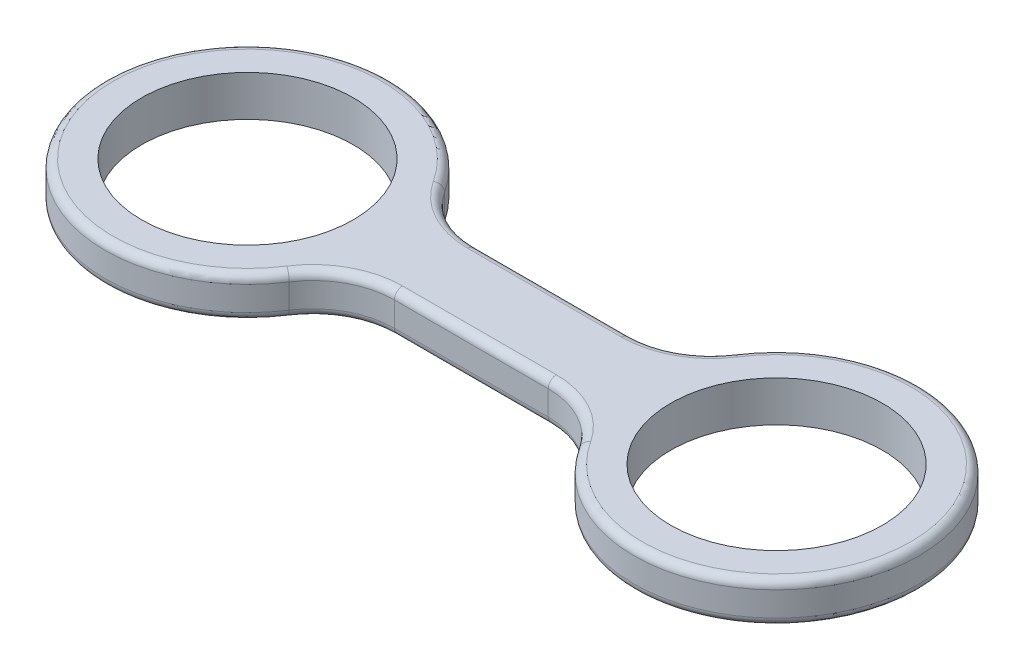
ISO-10303-21;
HEADER;
FILE_DESCRIPTION(('STEP AP214'),'2;1');
FILE_NAME('part.step','',(''),(''),'','','');
FILE_SCHEMA(('AUTOMOTIVE_DESIGN { 1 0 10303 214 1 1 1 1 }'));
ENDSEC;
DATA;
#1=APPLICATION_CONTEXT('core data for automotive mechanical design processes');
#2=APPLICATION_PROTOCOL_DEFINITION('international standard','automotive_design',2000,#1);
#3=PRODUCT_CONTEXT('',#1,'mechanical');
#4=PRODUCT('Part','Part','',(#3));
#5=PRODUCT_RELATED_PRODUCT_CATEGORY('part','',(#4));
#6=PRODUCT_DEFINITION_FORMATION('','',#4);
#7=PRODUCT_DEFINITION_CONTEXT('part definition',#1,'design');
#8=PRODUCT_DEFINITION('design','',#6,#7);
#9=PRODUCT_DEFINITION_SHAPE('','',#8);
#10=(LENGTH_UNIT() NAMED_UNIT(*) SI_UNIT(.MILLI.,.METRE.));
#11=(NAMED_UNIT(*) PLANE_ANGLE_UNIT() SI_UNIT($,.RADIAN.));
#12=(NAMED_UNIT(*) SI_UNIT($,.STERADIAN.) SOLID_ANGLE_UNIT());
#13=UNCERTAINTY_MEASURE_WITH_UNIT(LENGTH_MEASURE(1.E-05),#10,'distance_accuracy_value','');
#14=(GEOMETRIC_REPRESENTATION_CONTEXT(3) GLOBAL_UNCERTAINTY_ASSIGNED_CONTEXT((#13)) GLOBAL_UNIT_ASSIGNED_CONTEXT((#10,
#11,#12)) REPRESENTATION_CONTEXT('',''));
#15=CARTESIAN_POINT('',(0.,0.,0.));
#16=DIRECTION('',(0.,0.,1.));
#17=DIRECTION('',(1.,0.,0.));
#18=AXIS2_PLACEMENT_3D('',#15,#16,#17);
#19=CARTESIAN_POINT('',(0.,5.,0.));
#20=DIRECTION('',(0.,1.,0.));
#21=DIRECTION('',(0.,0.,1.));
#22=AXIS2_PLACEMENT_3D('',#19,#20,#21);
#23=PLANE('',#22);
#24=DIRECTION('',(-1.,0.,0.));
#25=VECTOR('',#24,1.);
#26=CARTESIAN_POINT('',(23.0488611432322,5.,-4.));
#27=LINE('',#26,#25);
#28=CARTESIAN_POINT('',(41.9511388567678,5.,-4.));
#29=VERTEX_POINT('',#28);
#30=CARTESIAN_POINT('',(23.0488611432322,5.,-4.));
#31=VERTEX_POINT('',#30);
#32=EDGE_CURVE('E61',#29,#31,#27,.T.);
#33=ORIENTED_EDGE('',*,*,#32,.T.);
#34=CARTESIAN_POINT('',(23.0488611432322,5.,-15.));
#35=DIRECTION('',(0.,1.,0.));
#36=DIRECTION('',(0.,0.,1.));
#37=AXIS2_PLACEMENT_3D('',#34,#35,#36);
#38=CIRCLE('',#37,11.);
#39=CARTESIAN_POINT('',(13.8293166859393,5.,-9.));
#40=VERTEX_POINT('',#39);
#41=EDGE_CURVE('E275',#31,#40,#38,.F.);
#42=ORIENTED_EDGE('',*,*,#41,.T.);
#43=CARTESIAN_POINT('',(0.,5.,0.));
#44=DIRECTION('',(0.,1.,0.));
#45=DIRECTION('',(0.,0.,1.));
#46=AXIS2_PLACEMENT_3D('',#43,#44,#45);
#47=CIRCLE('',#46,16.5);
#48=CARTESIAN_POINT('',(13.8293166859393,5.,9.));
#49=VERTEX_POINT('',#48);
#50=EDGE_CURVE('E256',#40,#49,#47,.T.);
#51=ORIENTED_EDGE('',*,*,#50,.T.);
#52=CARTESIAN_POINT('',(23.0488611432322,5.,15.));
#53=DIRECTION('',(0.,1.,0.));
#54=DIRECTION('',(0.,0.,1.));
#55=AXIS2_PLACEMENT_3D('',#52,#53,#54);
#56=CIRCLE('',#55,11.);
#57=CARTESIAN_POINT('',(23.0488611432322,5.,4.));
#58=VERTEX_POINT('',#57);
#59=EDGE_CURVE('E259',#49,#58,#56,.F.);
#60=ORIENTED_EDGE('',*,*,#59,.T.);
#61=DIRECTION('',(1.,0.,0.));
#62=VECTOR('',#61,1.);
#63=CARTESIAN_POINT('',(41.9511388567678,5.,4.));
#64=LINE('',#63,#62);
#65=CARTESIAN_POINT('',(41.9511388567678,5.,4.));
#66=VERTEX_POINT('',#65);
#67=EDGE_CURVE('E262',#58,#66,#64,.T.);
#68=ORIENTED_EDGE('',*,*,#67,.T.);
#69=CARTESIAN_POINT('',(41.9511388567678,5.,15.));
#70=DIRECTION('',(0.,1.,0.));
#71=DIRECTION('',(0.,0.,1.));
#72=AXIS2_PLACEMENT_3D('',#69,#70,#71);
#73=CIRCLE('',#72,11.);
#74=CARTESIAN_POINT('',(51.1706833140607,5.,9.));
#75=VERTEX_POINT('',#74);
#76=EDGE_CURVE('E265',#66,#75,#73,.F.);
#77=ORIENTED_EDGE('',*,*,#76,.T.);
#78=CARTESIAN_POINT('',(65.,5.,0.));
#79=DIRECTION('',(0.,1.,0.));
#80=DIRECTION('',(0.,0.,1.));
#81=AXIS2_PLACEMENT_3D('',#78,#79,#80);
#82=CIRCLE('',#81,16.5);
#83=CARTESIAN_POINT('',(51.1706833140607,5.,-9.));
#84=VERTEX_POINT('',#83);
#85=EDGE_CURVE('E268',#75,#84,#82,.T.);
#86=ORIENTED_EDGE('',*,*,#85,.T.);
#87=CARTESIAN_POINT('',(41.9511388567678,5.,-15.));
#88=DIRECTION('',(0.,1.,0.));
#89=DIRECTION('',(0.,0.,1.));
#90=AXIS2_PLACEMENT_3D('',#87,#88,#89);
#91=CIRCLE('',#90,11.);
#92=EDGE_CURVE('E66',#84,#29,#91,.F.);
#93=ORIENTED_EDGE('',*,*,#92,.T.);
#94=EDGE_LOOP('',(#33,#42,#51,#60,#68,#77,#86,#93));
#95=FACE_BOUND('',#94,.T.);
#96=CARTESIAN_POINT('',(0.,5.,0.));
#97=DIRECTION('',(0.,1.,0.));
#98=DIRECTION('',(0.,0.,1.));
#99=AXIS2_PLACEMENT_3D('',#96,#97,#98);
#100=CIRCLE('',#99,13.);
#101=CARTESIAN_POINT('',(0.,5.,13.));
#102=VERTEX_POINT('',#101);
#103=EDGE_CURVE('E715',#102,#102,#100,.T.);
#104=ORIENTED_EDGE('',*,*,#103,.F.);
#105=EDGE_LOOP('',(#104));
#106=FACE_BOUND('',#105,.T.);
#107=CARTESIAN_POINT('',(65.,5.,0.));
#108=DIRECTION('',(0.,1.,0.));
#109=DIRECTION('',(0.,0.,1.));
#110=AXIS2_PLACEMENT_3D('',#107,#108,#109);
#111=CIRCLE('',#110,13.);
#112=CARTESIAN_POINT('',(65.,5.,13.));
#113=VERTEX_POINT('',#112);
#114=EDGE_CURVE('E720',#113,#113,#111,.T.);
#115=ORIENTED_EDGE('',*,*,#114,.F.);
#116=EDGE_LOOP('',(#115));
#117=FACE_BOUND('',#116,.T.);
#118=ADVANCED_FACE('F43',(#95,#106,#117),#23,.T.);
#119=CARTESIAN_POINT('',(0.,0.,0.));
#120=DIRECTION('',(0.,1.,0.));
#121=DIRECTION('',(0.,0.,1.));
#122=AXIS2_PLACEMENT_3D('',#119,#120,#121);
#123=PLANE('',#122);
#124=CARTESIAN_POINT('',(0.,0.,0.));
#125=DIRECTION('',(0.,1.,0.));
#126=DIRECTION('',(0.,0.,1.));
#127=AXIS2_PLACEMENT_3D('',#124,#125,#126);
#128=CIRCLE('',#127,16.5);
#129=CARTESIAN_POINT('',(13.8293166859393,0.,9.));
#130=VERTEX_POINT('',#129);
#131=CARTESIAN_POINT('',(13.8293166859393,0.,-9.));
#132=VERTEX_POINT('',#131);
#133=EDGE_CURVE('E163',#130,#132,#128,.F.);
#134=ORIENTED_EDGE('',*,*,#133,.T.);
#135=CARTESIAN_POINT('',(23.0488611432322,0.,-15.));
#136=DIRECTION('',(0.,1.,0.));
#137=DIRECTION('',(0.,0.,1.));
#138=AXIS2_PLACEMENT_3D('',#135,#136,#137);
#139=CIRCLE('',#138,11.);
#140=CARTESIAN_POINT('',(23.0488611432322,0.,-4.));
#141=VERTEX_POINT('',#140);
#142=EDGE_CURVE('E210',#132,#141,#139,.T.);
#143=ORIENTED_EDGE('',*,*,#142,.T.);
#144=DIRECTION('',(-1.,0.,0.));
#145=VECTOR('',#144,1.);
#146=CARTESIAN_POINT('',(0.,0.,-4.));
#147=LINE('',#146,#145);
#148=CARTESIAN_POINT('',(41.9511388567678,0.,-4.));
#149=VERTEX_POINT('',#148);
#150=EDGE_CURVE('E207',#141,#149,#147,.F.);
#151=ORIENTED_EDGE('',*,*,#150,.T.);
#152=CARTESIAN_POINT('',(41.9511388567678,0.,-15.));
#153=DIRECTION('',(0.,1.,0.));
#154=DIRECTION('',(0.,0.,1.));
#155=AXIS2_PLACEMENT_3D('',#152,#153,#154);
#156=CIRCLE('',#155,11.);
#157=CARTESIAN_POINT('',(51.1706833140607,0.,-9.));
#158=VERTEX_POINT('',#157);
#159=EDGE_CURVE('E204',#149,#158,#156,.T.);
#160=ORIENTED_EDGE('',*,*,#159,.T.);
#161=CARTESIAN_POINT('',(65.,0.,0.));
#162=DIRECTION('',(0.,1.,0.));
#163=DIRECTION('',(0.,0.,1.));
#164=AXIS2_PLACEMENT_3D('',#161,#162,#163);
#165=CIRCLE('',#164,16.5);
#166=CARTESIAN_POINT('',(51.1706833140607,0.,9.));
#167=VERTEX_POINT('',#166);
#168=EDGE_CURVE('E201',#158,#167,#165,.F.);
#169=ORIENTED_EDGE('',*,*,#168,.T.);
#170=CARTESIAN_POINT('',(41.9511388567678,0.,15.));
#171=DIRECTION('',(0.,1.,0.));
#172=DIRECTION('',(0.,0.,1.));
#173=AXIS2_PLACEMENT_3D('',#170,#171,#172);
#174=CIRCLE('',#173,11.);
#175=CARTESIAN_POINT('',(41.9511388567678,0.,4.));
#176=VERTEX_POINT('',#175);
#177=EDGE_CURVE('E198',#167,#176,#174,.T.);
#178=ORIENTED_EDGE('',*,*,#177,.T.);
#179=DIRECTION('',(1.,0.,0.));
#180=VECTOR('',#179,1.);
#181=CARTESIAN_POINT('',(0.,0.,4.));
#182=LINE('',#181,#180);
#183=CARTESIAN_POINT('',(23.0488611432322,0.,4.));
#184=VERTEX_POINT('',#183);
#185=EDGE_CURVE('E166',#176,#184,#182,.F.);
#186=ORIENTED_EDGE('',*,*,#185,.T.);
#187=CARTESIAN_POINT('',(23.0488611432322,0.,15.));
#188=DIRECTION('',(0.,1.,0.));
#189=DIRECTION('',(0.,0.,1.));
#190=AXIS2_PLACEMENT_3D('',#187,#188,#189);
#191=CIRCLE('',#190,11.);
#192=EDGE_CURVE('E157',#184,#130,#191,.T.);
#193=ORIENTED_EDGE('',*,*,#192,.T.);
#194=EDGE_LOOP('',(#134,#143,#151,#160,#169,#178,#186,#193));
#195=FACE_BOUND('',#194,.T.);
#196=CARTESIAN_POINT('',(0.,0.,0.));
#197=DIRECTION('',(0.,1.,0.));
#198=DIRECTION('',(0.,0.,1.));
#199=AXIS2_PLACEMENT_3D('',#196,#197,#198);
#200=CIRCLE('',#199,13.);
#201=CARTESIAN_POINT('',(0.,0.,13.));
#202=VERTEX_POINT('',#201);
#203=EDGE_CURVE('E718',#202,#202,#200,.T.);
#204=ORIENTED_EDGE('',*,*,#203,.T.);
#205=EDGE_LOOP('',(#204));
#206=FACE_BOUND('',#205,.T.);
#207=CARTESIAN_POINT('',(65.,0.,0.));
#208=DIRECTION('',(0.,1.,0.));
#209=DIRECTION('',(0.,0.,1.));
#210=AXIS2_PLACEMENT_3D('',#207,#208,#209);
#211=CIRCLE('',#210,13.);
#212=CARTESIAN_POINT('',(65.,0.,13.));
#213=VERTEX_POINT('',#212);
#214=EDGE_CURVE('E302',#213,#213,#211,.T.);
#215=ORIENTED_EDGE('',*,*,#214,.T.);
#216=EDGE_LOOP('',(#215));
#217=FACE_BOUND('',#216,.T.);
#218=ADVANCED_FACE('F159',(#195,#206,#217),#123,.F.);
#219=CARTESIAN_POINT('',(0.,5.,0.));
#220=DIRECTION('',(0.,-1.,0.));
#221=DIRECTION('',(0.,0.,-1.));
#222=AXIS2_PLACEMENT_3D('',#219,#220,#221);
#223=CYLINDRICAL_SURFACE('',#222,17.5);
#224=DIRECTION('',(0.,-1.,0.));
#225=VECTOR('',#224,1.);
#226=CARTESIAN_POINT('',(14.6674570911478,5.,-9.54545454545454));
#227=LINE('',#226,#225);
#228=CARTESIAN_POINT('',(14.6674570911478,4.,-9.54545454545454));
#229=VERTEX_POINT('',#228);
#230=CARTESIAN_POINT('',(14.6674570911478,1.,-9.54545454545454));
#231=VERTEX_POINT('',#230);
#232=EDGE_CURVE('E359',#229,#231,#227,.T.);
#233=ORIENTED_EDGE('',*,*,#232,.T.);
#234=CARTESIAN_POINT('',(0.,1.,0.));
#235=DIRECTION('',(0.,1.,0.));
#236=DIRECTION('',(0.,0.,1.));
#237=AXIS2_PLACEMENT_3D('',#234,#235,#236);
#238=CIRCLE('',#237,17.5);
#239=CARTESIAN_POINT('',(14.6674570911478,1.,9.54545454545454));
#240=VERTEX_POINT('',#239);
#241=EDGE_CURVE('E11',#231,#240,#238,.T.);
#242=ORIENTED_EDGE('',*,*,#241,.T.);
#243=DIRECTION('',(0.,-1.,0.));
#244=VECTOR('',#243,1.);
#245=CARTESIAN_POINT('',(14.6674570911478,5.,9.54545454545454));
#246=LINE('',#245,#244);
#247=CARTESIAN_POINT('',(14.6674570911478,4.,9.54545454545454));
#248=VERTEX_POINT('',#247);
#249=EDGE_CURVE('E366',#240,#248,#246,.F.);
#250=ORIENTED_EDGE('',*,*,#249,.T.);
#251=CARTESIAN_POINT('',(0.,4.,0.));
#252=DIRECTION('',(0.,1.,0.));
#253=DIRECTION('',(0.,0.,1.));
#254=AXIS2_PLACEMENT_3D('',#251,#252,#253);
#255=CIRCLE('',#254,17.5);
#256=EDGE_CURVE('E53',#248,#229,#255,.F.);
#257=ORIENTED_EDGE('',*,*,#256,.T.);
#258=EDGE_LOOP('',(#233,#242,#250,#257));
#259=FACE_BOUND('',#258,.T.);
#260=ADVANCED_FACE('F423',(#259),#223,.T.);
#261=CARTESIAN_POINT('',(16.7705098312484,5.,5.));
#262=DIRECTION('',(0.,0.,-1.));
#263=DIRECTION('',(-1.,0.,0.));
#264=AXIS2_PLACEMENT_3D('',#261,#262,#263);
#265=PLANE('',#264);
#266=DIRECTION('',(0.,1.,0.));
#267=VECTOR('',#266,1.);
#268=CARTESIAN_POINT('',(23.0488611432322,0.,5.));
#269=LINE('',#268,#267);
#270=CARTESIAN_POINT('',(23.0488611432322,4.,5.));
#271=VERTEX_POINT('',#270);
#272=CARTESIAN_POINT('',(23.0488611432322,1.,5.));
#273=VERTEX_POINT('',#272);
#274=EDGE_CURVE('E360',#271,#273,#269,.F.);
#275=ORIENTED_EDGE('',*,*,#274,.T.);
#276=DIRECTION('',(1.,0.,0.));
#277=VECTOR('',#276,1.);
#278=CARTESIAN_POINT('',(16.7705098312484,1.,5.));
#279=LINE('',#278,#277);
#280=CARTESIAN_POINT('',(41.9511388567678,1.,5.));
#281=VERTEX_POINT('',#280);
#282=EDGE_CURVE('E248',#273,#281,#279,.T.);
#283=ORIENTED_EDGE('',*,*,#282,.T.);
#284=DIRECTION('',(0.,1.,0.));
#285=VECTOR('',#284,1.);
#286=CARTESIAN_POINT('',(41.9511388567678,5.,5.));
#287=LINE('',#286,#285);
#288=CARTESIAN_POINT('',(41.9511388567678,4.,5.));
#289=VERTEX_POINT('',#288);
#290=EDGE_CURVE('E349',#281,#289,#287,.T.);
#291=ORIENTED_EDGE('',*,*,#290,.T.);
#292=DIRECTION('',(1.,0.,0.));
#293=VECTOR('',#292,1.);
#294=CARTESIAN_POINT('',(23.0488611432322,4.,5.));
#295=LINE('',#294,#293);
#296=EDGE_CURVE('E245',#289,#271,#295,.F.);
#297=ORIENTED_EDGE('',*,*,#296,.T.);
#298=EDGE_LOOP('',(#275,#283,#291,#297));
#299=FACE_BOUND('',#298,.T.);
#300=ADVANCED_FACE('F355',(#299),#265,.F.);
#301=CARTESIAN_POINT('',(65.,5.,0.));
#302=DIRECTION('',(0.,-1.,0.));
#303=DIRECTION('',(0.,0.,-1.));
#304=AXIS2_PLACEMENT_3D('',#301,#302,#303);
#305=CYLINDRICAL_SURFACE('',#304,17.5);
#306=DIRECTION('',(0.,-1.,0.));
#307=VECTOR('',#306,1.);
#308=CARTESIAN_POINT('',(50.3325429088522,5.,9.54545454545455));
#309=LINE('',#308,#307);
#310=CARTESIAN_POINT('',(50.3325429088522,4.,9.54545454545455));
#311=VERTEX_POINT('',#310);
#312=CARTESIAN_POINT('',(50.3325429088522,1.,9.54545454545455));
#313=VERTEX_POINT('',#312);
#314=EDGE_CURVE('E352',#311,#313,#309,.T.);
#315=ORIENTED_EDGE('',*,*,#314,.T.);
#316=CARTESIAN_POINT('',(65.,1.,0.));
#317=DIRECTION('',(0.,1.,0.));
#318=DIRECTION('',(0.,0.,1.));
#319=AXIS2_PLACEMENT_3D('',#316,#317,#318);
#320=CIRCLE('',#319,17.5);
#321=CARTESIAN_POINT('',(50.3325429088522,1.,-9.54545454545455));
#322=VERTEX_POINT('',#321);
#323=EDGE_CURVE('E236',#313,#322,#320,.T.);
#324=ORIENTED_EDGE('',*,*,#323,.T.);
#325=DIRECTION('',(0.,-1.,0.));
#326=VECTOR('',#325,1.);
#327=CARTESIAN_POINT('',(50.3325429088522,5.,-9.54545454545455));
#328=LINE('',#327,#326);
#329=CARTESIAN_POINT('',(50.3325429088522,4.,-9.54545454545455));
#330=VERTEX_POINT('',#329);
#331=EDGE_CURVE('E725',#322,#330,#328,.F.);
#332=ORIENTED_EDGE('',*,*,#331,.T.);
#333=CARTESIAN_POINT('',(65.,4.,0.));
#334=DIRECTION('',(0.,1.,0.));
#335=DIRECTION('',(0.,0.,1.));
#336=AXIS2_PLACEMENT_3D('',#333,#334,#335);
#337=CIRCLE('',#336,17.5);
#338=EDGE_CURVE('E233',#330,#311,#337,.F.);
#339=ORIENTED_EDGE('',*,*,#338,.T.);
#340=EDGE_LOOP('',(#315,#324,#332,#339));
#341=FACE_BOUND('',#340,.T.);
#342=ADVANCED_FACE('F432',(#341),#305,.T.);
#343=CARTESIAN_POINT('',(16.7705098312484,5.,-5.));
#344=DIRECTION('',(0.,0.,1.));
#345=DIRECTION('',(1.,0.,0.));
#346=AXIS2_PLACEMENT_3D('',#343,#344,#345);
#347=PLANE('',#346);
#348=DIRECTION('',(0.,1.,0.));
#349=VECTOR('',#348,1.);
#350=CARTESIAN_POINT('',(41.9511388567678,0.,-5.));
#351=LINE('',#350,#349);
#352=CARTESIAN_POINT('',(41.9511388567678,4.,-5.));
#353=VERTEX_POINT('',#352);
#354=CARTESIAN_POINT('',(41.9511388567678,1.,-5.));
#355=VERTEX_POINT('',#354);
#356=EDGE_CURVE('E187',#353,#355,#351,.F.);
#357=ORIENTED_EDGE('',*,*,#356,.T.);
#358=DIRECTION('',(-1.,0.,0.));
#359=VECTOR('',#358,1.);
#360=CARTESIAN_POINT('',(16.7705098312484,1.,-5.));
#361=LINE('',#360,#359);
#362=CARTESIAN_POINT('',(23.0488611432322,1.,-5.));
#363=VERTEX_POINT('',#362);
#364=EDGE_CURVE('E224',#355,#363,#361,.T.);
#365=ORIENTED_EDGE('',*,*,#364,.T.);
#366=DIRECTION('',(0.,1.,0.));
#367=VECTOR('',#366,1.);
#368=CARTESIAN_POINT('',(23.0488611432322,5.,-5.));
#369=LINE('',#368,#367);
#370=CARTESIAN_POINT('',(23.0488611432322,4.,-5.));
#371=VERTEX_POINT('',#370);
#372=EDGE_CURVE('E192',#363,#371,#369,.T.);
#373=ORIENTED_EDGE('',*,*,#372,.T.);
#374=DIRECTION('',(-1.,0.,0.));
#375=VECTOR('',#374,1.);
#376=CARTESIAN_POINT('',(41.9511388567678,4.,-5.));
#377=LINE('',#376,#375);
#378=EDGE_CURVE('E221',#371,#353,#377,.F.);
#379=ORIENTED_EDGE('',*,*,#378,.T.);
#380=EDGE_LOOP('',(#357,#365,#373,#379));
#381=FACE_BOUND('',#380,.T.);
#382=ADVANCED_FACE('F378',(#381),#347,.F.);
#383=CARTESIAN_POINT('',(0.,5.,0.));
#384=DIRECTION('',(0.,-1.,0.));
#385=DIRECTION('',(0.,0.,-1.));
#386=AXIS2_PLACEMENT_3D('',#383,#384,#385);
#387=CYLINDRICAL_SURFACE('',#386,13.);
#388=ORIENTED_EDGE('',*,*,#103,.T.);
#389=EDGE_LOOP('',(#388));
#390=FACE_BOUND('',#389,.T.);
#391=ORIENTED_EDGE('',*,*,#203,.F.);
#392=EDGE_LOOP('',(#391));
#393=FACE_BOUND('',#392,.T.);
#394=ADVANCED_FACE('F427',(#390,#393),#387,.F.);
#395=CARTESIAN_POINT('',(65.,5.,0.));
#396=DIRECTION('',(0.,-1.,0.));
#397=DIRECTION('',(0.,0.,-1.));
#398=AXIS2_PLACEMENT_3D('',#395,#396,#397);
#399=CYLINDRICAL_SURFACE('',#398,13.);
#400=ORIENTED_EDGE('',*,*,#114,.T.);
#401=EDGE_LOOP('',(#400));
#402=FACE_BOUND('',#401,.T.);
#403=ORIENTED_EDGE('',*,*,#214,.F.);
#404=EDGE_LOOP('',(#403));
#405=FACE_BOUND('',#404,.T.);
#406=ADVANCED_FACE('F444',(#402,#405),#399,.F.);
#407=CARTESIAN_POINT('',(41.9511388567678,5.,15.));
#408=DIRECTION('',(0.,-1.,0.));
#409=DIRECTION('',(0.,0.,-1.));
#410=AXIS2_PLACEMENT_3D('',#407,#408,#409);
#411=CYLINDRICAL_SURFACE('',#410,10.);
#412=ORIENTED_EDGE('',*,*,#290,.F.);
#413=CARTESIAN_POINT('',(41.9511388567678,1.,15.));
#414=DIRECTION('',(0.,1.,0.));
#415=DIRECTION('',(0.,0.,1.));
#416=AXIS2_PLACEMENT_3D('',#413,#414,#415);
#417=CIRCLE('',#416,10.);
#418=EDGE_CURVE('E242',#281,#313,#417,.F.);
#419=ORIENTED_EDGE('',*,*,#418,.T.);
#420=ORIENTED_EDGE('',*,*,#314,.F.);
#421=CARTESIAN_POINT('',(41.9511388567678,4.,15.));
#422=DIRECTION('',(0.,1.,0.));
#423=DIRECTION('',(0.,0.,1.));
#424=AXIS2_PLACEMENT_3D('',#421,#422,#423);
#425=CIRCLE('',#424,10.);
#426=EDGE_CURVE('E239',#311,#289,#425,.T.);
#427=ORIENTED_EDGE('',*,*,#426,.T.);
#428=EDGE_LOOP('',(#412,#419,#420,#427));
#429=FACE_BOUND('',#428,.T.);
#430=ADVANCED_FACE('F348',(#429),#411,.F.);
#431=CARTESIAN_POINT('',(23.0488611432322,5.,15.));
#432=DIRECTION('',(0.,-1.,0.));
#433=DIRECTION('',(0.,0.,-1.));
#434=AXIS2_PLACEMENT_3D('',#431,#432,#433);
#435=CYLINDRICAL_SURFACE('',#434,10.);
#436=ORIENTED_EDGE('',*,*,#249,.F.);
#437=CARTESIAN_POINT('',(23.0488611432322,1.,15.));
#438=DIRECTION('',(0.,1.,0.));
#439=DIRECTION('',(0.,0.,1.));
#440=AXIS2_PLACEMENT_3D('',#437,#438,#439);
#441=CIRCLE('',#440,10.);
#442=EDGE_CURVE('E176',#240,#273,#441,.F.);
#443=ORIENTED_EDGE('',*,*,#442,.T.);
#444=ORIENTED_EDGE('',*,*,#274,.F.);
#445=CARTESIAN_POINT('',(23.0488611432322,4.,15.));
#446=DIRECTION('',(0.,1.,0.));
#447=DIRECTION('',(0.,0.,1.));
#448=AXIS2_PLACEMENT_3D('',#445,#446,#447);
#449=CIRCLE('',#448,10.);
#450=EDGE_CURVE('E251',#271,#248,#449,.T.);
#451=ORIENTED_EDGE('',*,*,#450,.T.);
#452=EDGE_LOOP('',(#436,#443,#444,#451));
#453=FACE_BOUND('',#452,.T.);
#454=ADVANCED_FACE('F443',(#453),#435,.F.);
#455=CARTESIAN_POINT('',(41.9511388567678,5.,-15.));
#456=DIRECTION('',(0.,-1.,0.));
#457=DIRECTION('',(0.,0.,-1.));
#458=AXIS2_PLACEMENT_3D('',#455,#456,#457);
#459=CYLINDRICAL_SURFACE('',#458,10.);
#460=ORIENTED_EDGE('',*,*,#331,.F.);
#461=CARTESIAN_POINT('',(41.9511388567678,1.,-15.));
#462=DIRECTION('',(0.,1.,0.));
#463=DIRECTION('',(0.,0.,1.));
#464=AXIS2_PLACEMENT_3D('',#461,#462,#463);
#465=CIRCLE('',#464,10.);
#466=EDGE_CURVE('E230',#322,#355,#465,.F.);
#467=ORIENTED_EDGE('',*,*,#466,.T.);
#468=ORIENTED_EDGE('',*,*,#356,.F.);
#469=CARTESIAN_POINT('',(41.9511388567678,4.,-15.));
#470=DIRECTION('',(0.,1.,0.));
#471=DIRECTION('',(0.,0.,1.));
#472=AXIS2_PLACEMENT_3D('',#469,#470,#471);
#473=CIRCLE('',#472,10.);
#474=EDGE_CURVE('E227',#353,#330,#473,.T.);
#475=ORIENTED_EDGE('',*,*,#474,.T.);
#476=EDGE_LOOP('',(#460,#467,#468,#475));
#477=FACE_BOUND('',#476,.T.);
#478=ADVANCED_FACE('F447',(#477),#459,.F.);
#479=CARTESIAN_POINT('',(23.0488611432322,5.,-15.));
#480=DIRECTION('',(0.,-1.,0.));
#481=DIRECTION('',(0.,0.,-1.));
#482=AXIS2_PLACEMENT_3D('',#479,#480,#481);
#483=CYLINDRICAL_SURFACE('',#482,10.);
#484=ORIENTED_EDGE('',*,*,#372,.F.);
#485=CARTESIAN_POINT('',(23.0488611432322,1.,-15.));
#486=DIRECTION('',(0.,1.,0.));
#487=DIRECTION('',(0.,0.,1.));
#488=AXIS2_PLACEMENT_3D('',#485,#486,#487);
#489=CIRCLE('',#488,10.);
#490=EDGE_CURVE('E217',#363,#231,#489,.F.);
#491=ORIENTED_EDGE('',*,*,#490,.T.);
#492=ORIENTED_EDGE('',*,*,#232,.F.);
#493=CARTESIAN_POINT('',(23.0488611432322,4.,-15.));
#494=DIRECTION('',(0.,1.,0.));
#495=DIRECTION('',(0.,0.,1.));
#496=AXIS2_PLACEMENT_3D('',#493,#494,#495);
#497=CIRCLE('',#496,10.);
#498=EDGE_CURVE('E213',#229,#371,#497,.T.);
#499=ORIENTED_EDGE('',*,*,#498,.T.);
#500=EDGE_LOOP('',(#484,#491,#492,#499));
#501=FACE_BOUND('',#500,.T.);
#502=ADVANCED_FACE('F384',(#501),#483,.F.);
#503=CARTESIAN_POINT('',(41.9511388567678,1.,15.));
#504=DIRECTION('',(0.,1.,0.));
#505=DIRECTION('',(0.,0.,1.));
#506=AXIS2_PLACEMENT_3D('',#503,#504,#505);
#507=TOROIDAL_SURFACE('',#506,11.,1.);
#508=CARTESIAN_POINT('',(51.1706833140607,1.,9.));
#509=DIRECTION('',(0.545454545454545,0.,0.838140405208444));
#510=DIRECTION('',(0.838140405208445,0.,-0.545454545454545));
#511=AXIS2_PLACEMENT_3D('',#508,#509,#510);
#512=CIRCLE('',#511,1.);
#513=EDGE_CURVE('E294',#313,#167,#512,.T.);
#514=ORIENTED_EDGE('',*,*,#513,.F.);
#515=ORIENTED_EDGE('',*,*,#418,.F.);
#516=CARTESIAN_POINT('',(41.9511388567678,1.,4.));
#517=DIRECTION('',(-1.,0.,0.));
#518=DIRECTION('',(0.,0.,1.));
#519=AXIS2_PLACEMENT_3D('',#516,#517,#518);
#520=CIRCLE('',#519,1.);
#521=EDGE_CURVE('E298',#176,#281,#520,.T.);
#522=ORIENTED_EDGE('',*,*,#521,.F.);
#523=ORIENTED_EDGE('',*,*,#177,.F.);
#524=EDGE_LOOP('',(#514,#515,#522,#523));
#525=FACE_BOUND('',#524,.T.);
#526=ADVANCED_FACE('F407',(#525),#507,.T.);
#527=CARTESIAN_POINT('',(16.7705098312484,1.,4.));
#528=DIRECTION('',(1.,0.,0.));
#529=DIRECTION('',(0.,0.,-1.));
#530=AXIS2_PLACEMENT_3D('',#527,#528,#529);
#531=CYLINDRICAL_SURFACE('',#530,1.);
#532=ORIENTED_EDGE('',*,*,#521,.T.);
#533=ORIENTED_EDGE('',*,*,#282,.F.);
#534=CARTESIAN_POINT('',(23.0488611432322,1.,4.));
#535=DIRECTION('',(-1.,0.,0.));
#536=DIRECTION('',(0.,0.,1.));
#537=AXIS2_PLACEMENT_3D('',#534,#535,#536);
#538=CIRCLE('',#537,1.);
#539=EDGE_CURVE('E291',#184,#273,#538,.T.);
#540=ORIENTED_EDGE('',*,*,#539,.F.);
#541=ORIENTED_EDGE('',*,*,#185,.F.);
#542=EDGE_LOOP('',(#532,#533,#540,#541));
#543=FACE_BOUND('',#542,.T.);
#544=ADVANCED_FACE('F409',(#543),#531,.T.);
#545=CARTESIAN_POINT('',(65.,1.,0.));
#546=DIRECTION('',(0.,1.,0.));
#547=DIRECTION('',(0.,0.,1.));
#548=AXIS2_PLACEMENT_3D('',#545,#546,#547);
#549=TOROIDAL_SURFACE('',#548,16.5,1.);
#550=ORIENTED_EDGE('',*,*,#513,.T.);
#551=ORIENTED_EDGE('',*,*,#168,.F.);
#552=CARTESIAN_POINT('',(51.1706833140607,1.,-9.));
#553=DIRECTION('',(-0.545454545454545,0.,0.838140405208444));
#554=DIRECTION('',(0.838140405208445,0.,0.545454545454545));
#555=AXIS2_PLACEMENT_3D('',#552,#553,#554);
#556=CIRCLE('',#555,1.);
#557=EDGE_CURVE('E180',#322,#158,#556,.T.);
#558=ORIENTED_EDGE('',*,*,#557,.F.);
#559=ORIENTED_EDGE('',*,*,#323,.F.);
#560=EDGE_LOOP('',(#550,#551,#558,#559));
#561=FACE_BOUND('',#560,.T.);
#562=ADVANCED_FACE('F402',(#561),#549,.T.);
#563=CARTESIAN_POINT('',(23.0488611432322,1.,15.));
#564=DIRECTION('',(0.,1.,0.));
#565=DIRECTION('',(0.,0.,1.));
#566=AXIS2_PLACEMENT_3D('',#563,#564,#565);
#567=TOROIDAL_SURFACE('',#566,11.,1.);
#568=ORIENTED_EDGE('',*,*,#539,.T.);
#569=ORIENTED_EDGE('',*,*,#442,.F.);
#570=CARTESIAN_POINT('',(13.8293166859393,1.,9.));
#571=DIRECTION('',(-0.545454545454545,0.,0.838140405208444));
#572=DIRECTION('',(0.838140405208445,0.,0.545454545454545));
#573=AXIS2_PLACEMENT_3D('',#570,#571,#572);
#574=CIRCLE('',#573,1.);
#575=EDGE_CURVE('E174',#130,#240,#574,.T.);
#576=ORIENTED_EDGE('',*,*,#575,.F.);
#577=ORIENTED_EDGE('',*,*,#192,.F.);
#578=EDGE_LOOP('',(#568,#569,#576,#577));
#579=FACE_BOUND('',#578,.T.);
#580=ADVANCED_FACE('F175',(#579),#567,.T.);
#581=CARTESIAN_POINT('',(41.9511388567678,1.,-15.));
#582=DIRECTION('',(0.,1.,0.));
#583=DIRECTION('',(0.,0.,1.));
#584=AXIS2_PLACEMENT_3D('',#581,#582,#583);
#585=TOROIDAL_SURFACE('',#584,11.,1.);
#586=ORIENTED_EDGE('',*,*,#557,.T.);
#587=ORIENTED_EDGE('',*,*,#159,.F.);
#588=CARTESIAN_POINT('',(41.9511388567678,1.,-4.));
#589=DIRECTION('',(-1.,0.,0.));
#590=DIRECTION('',(0.,0.,1.));
#591=AXIS2_PLACEMENT_3D('',#588,#589,#590);
#592=CIRCLE('',#591,1.);
#593=EDGE_CURVE('E181',#355,#149,#592,.T.);
#594=ORIENTED_EDGE('',*,*,#593,.F.);
#595=ORIENTED_EDGE('',*,*,#466,.F.);
#596=EDGE_LOOP('',(#586,#587,#594,#595));
#597=FACE_BOUND('',#596,.T.);
#598=ADVANCED_FACE('F397',(#597),#585,.T.);
#599=CARTESIAN_POINT('',(0.,1.,0.));
#600=DIRECTION('',(0.,1.,0.));
#601=DIRECTION('',(0.,0.,1.));
#602=AXIS2_PLACEMENT_3D('',#599,#600,#601);
#603=TOROIDAL_SURFACE('',#602,16.5,1.);
#604=ORIENTED_EDGE('',*,*,#575,.T.);
#605=ORIENTED_EDGE('',*,*,#241,.F.);
#606=CARTESIAN_POINT('',(13.8293166859393,1.,-9.));
#607=DIRECTION('',(0.545454545454546,0.,0.838140405208444));
#608=DIRECTION('',(0.838140405208444,0.,-0.545454545454546));
#609=AXIS2_PLACEMENT_3D('',#606,#607,#608);
#610=CIRCLE('',#609,1.);
#611=EDGE_CURVE('E184',#132,#231,#610,.T.);
#612=ORIENTED_EDGE('',*,*,#611,.F.);
#613=ORIENTED_EDGE('',*,*,#133,.F.);
#614=EDGE_LOOP('',(#604,#605,#612,#613));
#615=FACE_BOUND('',#614,.T.);
#616=ADVANCED_FACE('F183',(#615),#603,.T.);
#617=CARTESIAN_POINT('',(16.7705098312484,1.,-4.));
#618=DIRECTION('',(-1.,0.,0.));
#619=DIRECTION('',(0.,0.,1.));
#620=AXIS2_PLACEMENT_3D('',#617,#618,#619);
#621=CYLINDRICAL_SURFACE('',#620,1.);
#622=ORIENTED_EDGE('',*,*,#593,.T.);
#623=ORIENTED_EDGE('',*,*,#150,.F.);
#624=CARTESIAN_POINT('',(23.0488611432322,1.,-4.));
#625=DIRECTION('',(-1.,0.,0.));
#626=DIRECTION('',(0.,0.,1.));
#627=AXIS2_PLACEMENT_3D('',#624,#625,#626);
#628=CIRCLE('',#627,1.);
#629=EDGE_CURVE('E280',#363,#141,#628,.T.);
#630=ORIENTED_EDGE('',*,*,#629,.F.);
#631=ORIENTED_EDGE('',*,*,#364,.F.);
#632=EDGE_LOOP('',(#622,#623,#630,#631));
#633=FACE_BOUND('',#632,.T.);
#634=ADVANCED_FACE('F392',(#633),#621,.T.);
#635=CARTESIAN_POINT('',(23.0488611432322,1.,-15.));
#636=DIRECTION('',(0.,1.,0.));
#637=DIRECTION('',(0.,0.,1.));
#638=AXIS2_PLACEMENT_3D('',#635,#636,#637);
#639=TOROIDAL_SURFACE('',#638,11.,1.);
#640=ORIENTED_EDGE('',*,*,#611,.T.);
#641=ORIENTED_EDGE('',*,*,#490,.F.);
#642=ORIENTED_EDGE('',*,*,#629,.T.);
#643=ORIENTED_EDGE('',*,*,#142,.F.);
#644=EDGE_LOOP('',(#640,#641,#642,#643));
#645=FACE_BOUND('',#644,.T.);
#646=ADVANCED_FACE('F389',(#645),#639,.T.);
#647=CARTESIAN_POINT('',(41.9511388567678,4.,15.));
#648=DIRECTION('',(0.,1.,0.));
#649=DIRECTION('',(0.,0.,1.));
#650=AXIS2_PLACEMENT_3D('',#647,#648,#649);
#651=TOROIDAL_SURFACE('',#650,11.,1.);
#652=CARTESIAN_POINT('',(41.9511388567678,4.,4.));
#653=DIRECTION('',(-1.,0.,0.));
#654=DIRECTION('',(0.,0.,1.));
#655=AXIS2_PLACEMENT_3D('',#652,#653,#654);
#656=CIRCLE('',#655,1.);
#657=EDGE_CURVE('E324',#289,#66,#656,.T.);
#658=ORIENTED_EDGE('',*,*,#657,.F.);
#659=ORIENTED_EDGE('',*,*,#426,.F.);
#660=CARTESIAN_POINT('',(51.1706833140607,4.,9.));
#661=DIRECTION('',(0.545454545454544,0.,0.838140405208445));
#662=DIRECTION('',(0.838140405208445,0.,-0.545454545454544));
#663=AXIS2_PLACEMENT_3D('',#660,#661,#662);
#664=CIRCLE('',#663,1.);
#665=EDGE_CURVE('E47',#75,#311,#664,.T.);
#666=ORIENTED_EDGE('',*,*,#665,.F.);
#667=ORIENTED_EDGE('',*,*,#76,.F.);
#668=EDGE_LOOP('',(#658,#659,#666,#667));
#669=FACE_BOUND('',#668,.T.);
#670=ADVANCED_FACE('F45',(#669),#651,.T.);
#671=CARTESIAN_POINT('',(65.,4.,0.));
#672=DIRECTION('',(0.,1.,0.));
#673=DIRECTION('',(0.,0.,1.));
#674=AXIS2_PLACEMENT_3D('',#671,#672,#673);
#675=TOROIDAL_SURFACE('',#674,16.5,1.);
#676=ORIENTED_EDGE('',*,*,#665,.T.);
#677=ORIENTED_EDGE('',*,*,#338,.F.);
#678=CARTESIAN_POINT('',(51.1706833140607,4.,-9.));
#679=DIRECTION('',(-0.545454545454546,0.,0.838140405208444));
#680=DIRECTION('',(0.838140405208444,0.,0.545454545454546));
#681=AXIS2_PLACEMENT_3D('',#678,#679,#680);
#682=CIRCLE('',#681,1.);
#683=EDGE_CURVE('E321',#84,#330,#682,.T.);
#684=ORIENTED_EDGE('',*,*,#683,.F.);
#685=ORIENTED_EDGE('',*,*,#85,.F.);
#686=EDGE_LOOP('',(#676,#677,#684,#685));
#687=FACE_BOUND('',#686,.T.);
#688=ADVANCED_FACE('F339',(#687),#675,.T.);
#689=CARTESIAN_POINT('',(0.,4.,4.));
#690=DIRECTION('',(-1.,0.,0.));
#691=DIRECTION('',(0.,0.,1.));
#692=AXIS2_PLACEMENT_3D('',#689,#690,#691);
#693=CYLINDRICAL_SURFACE('',#692,1.);
#694=ORIENTED_EDGE('',*,*,#657,.T.);
#695=ORIENTED_EDGE('',*,*,#67,.F.);
#696=CARTESIAN_POINT('',(23.0488611432322,4.,4.));
#697=DIRECTION('',(-1.,0.,0.));
#698=DIRECTION('',(0.,0.,1.));
#699=AXIS2_PLACEMENT_3D('',#696,#697,#698);
#700=CIRCLE('',#699,1.);
#701=EDGE_CURVE('E317',#271,#58,#700,.T.);
#702=ORIENTED_EDGE('',*,*,#701,.F.);
#703=ORIENTED_EDGE('',*,*,#296,.F.);
#704=EDGE_LOOP('',(#694,#695,#702,#703));
#705=FACE_BOUND('',#704,.T.);
#706=ADVANCED_FACE('F494',(#705),#693,.T.);
#707=CARTESIAN_POINT('',(41.9511388567678,4.,-15.));
#708=DIRECTION('',(0.,1.,0.));
#709=DIRECTION('',(0.,0.,1.));
#710=AXIS2_PLACEMENT_3D('',#707,#708,#709);
#711=TOROIDAL_SURFACE('',#710,11.,1.);
#712=ORIENTED_EDGE('',*,*,#683,.T.);
#713=ORIENTED_EDGE('',*,*,#474,.F.);
#714=CARTESIAN_POINT('',(41.9511388567678,4.,-4.));
#715=DIRECTION('',(-1.,0.,0.));
#716=DIRECTION('',(0.,0.,1.));
#717=AXIS2_PLACEMENT_3D('',#714,#715,#716);
#718=CIRCLE('',#717,1.);
#719=EDGE_CURVE('E313',#29,#353,#718,.T.);
#720=ORIENTED_EDGE('',*,*,#719,.F.);
#721=ORIENTED_EDGE('',*,*,#92,.F.);
#722=EDGE_LOOP('',(#712,#713,#720,#721));
#723=FACE_BOUND('',#722,.T.);
#724=ADVANCED_FACE('F500',(#723),#711,.T.);
#725=CARTESIAN_POINT('',(23.0488611432322,4.,15.));
#726=DIRECTION('',(0.,1.,0.));
#727=DIRECTION('',(0.,0.,1.));
#728=AXIS2_PLACEMENT_3D('',#725,#726,#727);
#729=TOROIDAL_SURFACE('',#728,11.,1.);
#730=ORIENTED_EDGE('',*,*,#701,.T.);
#731=ORIENTED_EDGE('',*,*,#59,.F.);
#732=CARTESIAN_POINT('',(13.8293166859393,4.,9.));
#733=DIRECTION('',(-0.545454545454545,0.,0.838140405208444));
#734=DIRECTION('',(0.838140405208445,0.,0.545454545454545));
#735=AXIS2_PLACEMENT_3D('',#732,#733,#734);
#736=CIRCLE('',#735,1.);
#737=EDGE_CURVE('E309',#248,#49,#736,.T.);
#738=ORIENTED_EDGE('',*,*,#737,.F.);
#739=ORIENTED_EDGE('',*,*,#450,.F.);
#740=EDGE_LOOP('',(#730,#731,#738,#739));
#741=FACE_BOUND('',#740,.T.);
#742=ADVANCED_FACE('F507',(#741),#729,.T.);
#743=CARTESIAN_POINT('',(0.,4.,-4.));
#744=DIRECTION('',(1.,0.,0.));
#745=DIRECTION('',(0.,0.,-1.));
#746=AXIS2_PLACEMENT_3D('',#743,#744,#745);
#747=CYLINDRICAL_SURFACE('',#746,1.);
#748=ORIENTED_EDGE('',*,*,#719,.T.);
#749=ORIENTED_EDGE('',*,*,#378,.F.);
#750=CARTESIAN_POINT('',(23.0488611432322,4.,-4.));
#751=DIRECTION('',(-1.,0.,0.));
#752=DIRECTION('',(0.,0.,1.));
#753=AXIS2_PLACEMENT_3D('',#750,#751,#752);
#754=CIRCLE('',#753,1.);
#755=EDGE_CURVE('E306',#31,#371,#754,.T.);
#756=ORIENTED_EDGE('',*,*,#755,.F.);
#757=ORIENTED_EDGE('',*,*,#32,.F.);
#758=EDGE_LOOP('',(#748,#749,#756,#757));
#759=FACE_BOUND('',#758,.T.);
#760=ADVANCED_FACE('F515',(#759),#747,.T.);
#761=CARTESIAN_POINT('',(0.,4.,0.));
#762=DIRECTION('',(0.,1.,0.));
#763=DIRECTION('',(0.,0.,1.));
#764=AXIS2_PLACEMENT_3D('',#761,#762,#763);
#765=TOROIDAL_SURFACE('',#764,16.5,1.);
#766=ORIENTED_EDGE('',*,*,#737,.T.);
#767=ORIENTED_EDGE('',*,*,#50,.F.);
#768=CARTESIAN_POINT('',(13.8293166859393,4.,-9.));
#769=DIRECTION('',(0.545454545454545,0.,0.838140405208444));
#770=DIRECTION('',(0.838140405208445,0.,-0.545454545454545));
#771=AXIS2_PLACEMENT_3D('',#768,#769,#770);
#772=CIRCLE('',#771,1.);
#773=EDGE_CURVE('E303',#229,#40,#772,.T.);
#774=ORIENTED_EDGE('',*,*,#773,.F.);
#775=ORIENTED_EDGE('',*,*,#256,.F.);
#776=EDGE_LOOP('',(#766,#767,#774,#775));
#777=FACE_BOUND('',#776,.T.);
#778=ADVANCED_FACE('F523',(#777),#765,.T.);
#779=CARTESIAN_POINT('',(23.0488611432322,4.,-15.));
#780=DIRECTION('',(0.,1.,0.));
#781=DIRECTION('',(0.,0.,1.));
#782=AXIS2_PLACEMENT_3D('',#779,#780,#781);
#783=TOROIDAL_SURFACE('',#782,11.,1.);
#784=ORIENTED_EDGE('',*,*,#755,.T.);
#785=ORIENTED_EDGE('',*,*,#498,.F.);
#786=ORIENTED_EDGE('',*,*,#773,.T.);
#787=ORIENTED_EDGE('',*,*,#41,.F.);
#788=EDGE_LOOP('',(#784,#785,#786,#787));
#789=FACE_BOUND('',#788,.T.);
#790=ADVANCED_FACE('F531',(#789),#783,.T.);
#791=CLOSED_SHELL('',(#118,#218,#260,#300,#342,#382,#394,#406,#430,#454,#478,#502,#526,#544,
#562,#580,#598,#616,#634,#646,#670,#688,#706,#724,#742,#760,#778,#790));
#792=MANIFOLD_SOLID_BREP('B2',#791);
#793=ADVANCED_BREP_SHAPE_REPRESENTATION('',(#18,#792),#14);
#794=SHAPE_DEFINITION_REPRESENTATION(#9,#793);
ENDSEC;
END-ISO-10303-21;
